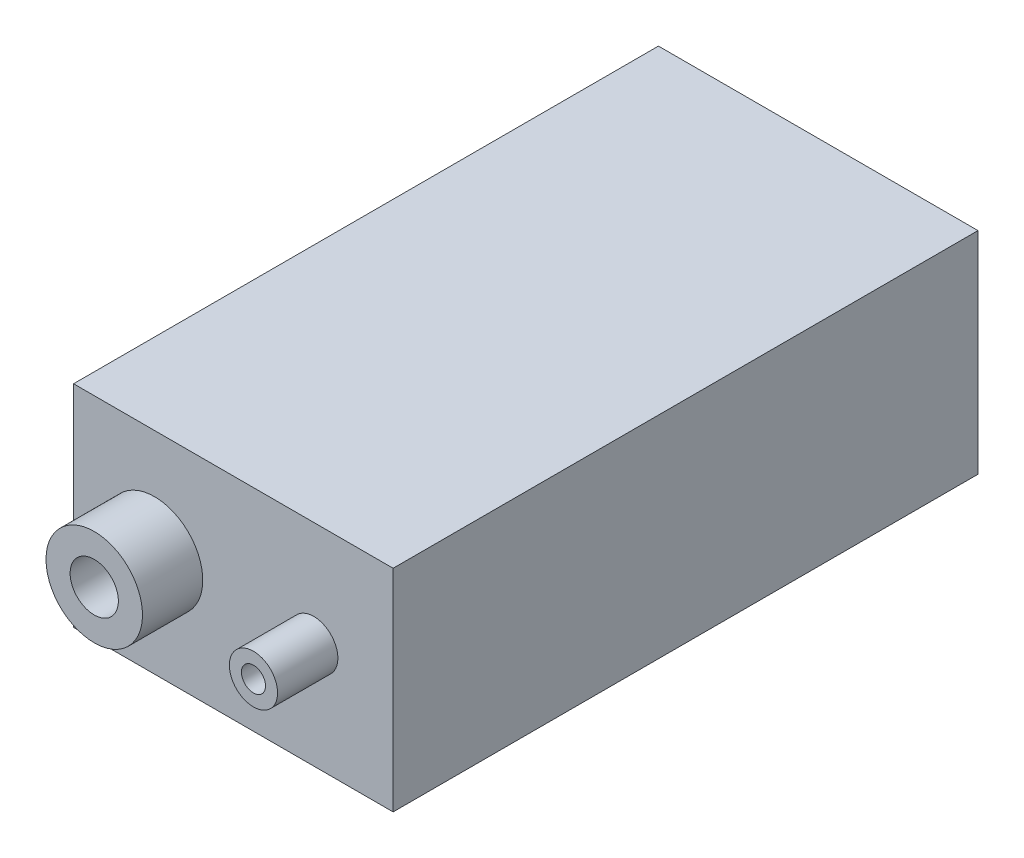
ISO-10303-21;
HEADER;
FILE_DESCRIPTION(('STEP AP214'),'2;1');
FILE_NAME('part.step','',(''),(''),'','','');
FILE_SCHEMA(('AUTOMOTIVE_DESIGN { 1 0 10303 214 1 1 1 1 }'));
ENDSEC;
DATA;
#1=APPLICATION_CONTEXT('core data for automotive mechanical design processes');
#2=APPLICATION_PROTOCOL_DEFINITION('international standard','automotive_design',2000,#1);
#3=PRODUCT_CONTEXT('',#1,'mechanical');
#4=PRODUCT('Part','Part','',(#3));
#5=PRODUCT_RELATED_PRODUCT_CATEGORY('part','',(#4));
#6=PRODUCT_DEFINITION_FORMATION('','',#4);
#7=PRODUCT_DEFINITION_CONTEXT('part definition',#1,'design');
#8=PRODUCT_DEFINITION('design','',#6,#7);
#9=PRODUCT_DEFINITION_SHAPE('','',#8);
#10=(LENGTH_UNIT() NAMED_UNIT(*) SI_UNIT(.MILLI.,.METRE.));
#11=(NAMED_UNIT(*) PLANE_ANGLE_UNIT() SI_UNIT($,.RADIAN.));
#12=(NAMED_UNIT(*) SI_UNIT($,.STERADIAN.) SOLID_ANGLE_UNIT());
#13=UNCERTAINTY_MEASURE_WITH_UNIT(LENGTH_MEASURE(1.E-05),#10,'distance_accuracy_value','');
#14=(GEOMETRIC_REPRESENTATION_CONTEXT(3) GLOBAL_UNCERTAINTY_ASSIGNED_CONTEXT((#13)) GLOBAL_UNIT_ASSIGNED_CONTEXT((#10,
#11,#12)) REPRESENTATION_CONTEXT('',''));
#15=CARTESIAN_POINT('',(0.,0.,0.));
#16=DIRECTION('',(0.,0.,1.));
#17=DIRECTION('',(1.,0.,0.));
#18=AXIS2_PLACEMENT_3D('',#15,#16,#17);
#19=CARTESIAN_POINT('',(0.,0.,48.5));
#20=DIRECTION('',(1.,0.,0.));
#21=DIRECTION('',(0.,0.,-1.));
#22=AXIS2_PLACEMENT_3D('',#19,#20,#21);
#23=PLANE('',#22);
#24=DIRECTION('',(0.,-1.,0.));
#25=VECTOR('',#24,1.);
#26=CARTESIAN_POINT('',(0.,0.,0.));
#27=LINE('',#26,#25);
#28=CARTESIAN_POINT('',(0.,17.5,0.));
#29=VERTEX_POINT('',#28);
#30=CARTESIAN_POINT('',(0.,0.,0.));
#31=VERTEX_POINT('',#30);
#32=EDGE_CURVE('E122',#29,#31,#27,.T.);
#33=ORIENTED_EDGE('',*,*,#32,.T.);
#34=DIRECTION('',(0.,0.,-1.));
#35=VECTOR('',#34,1.);
#36=CARTESIAN_POINT('',(0.,0.,48.5));
#37=LINE('',#36,#35);
#38=CARTESIAN_POINT('',(0.,0.,48.5));
#39=VERTEX_POINT('',#38);
#40=EDGE_CURVE('E110',#39,#31,#37,.T.);
#41=ORIENTED_EDGE('',*,*,#40,.F.);
#42=DIRECTION('',(0.,-1.,0.));
#43=VECTOR('',#42,1.);
#44=CARTESIAN_POINT('',(0.,0.,48.5));
#45=LINE('',#44,#43);
#46=CARTESIAN_POINT('',(0.,17.5,48.5));
#47=VERTEX_POINT('',#46);
#48=EDGE_CURVE('E102',#47,#39,#45,.T.);
#49=ORIENTED_EDGE('',*,*,#48,.F.);
#50=DIRECTION('',(0.,0.,-1.));
#51=VECTOR('',#50,1.);
#52=CARTESIAN_POINT('',(0.,17.5,48.5));
#53=LINE('',#52,#51);
#54=EDGE_CURVE('E118',#47,#29,#53,.T.);
#55=ORIENTED_EDGE('',*,*,#54,.T.);
#56=EDGE_LOOP('',(#33,#41,#49,#55));
#57=FACE_BOUND('',#56,.T.);
#58=ADVANCED_FACE('F49',(#57),#23,.F.);
#59=CARTESIAN_POINT('',(0.,0.,48.5));
#60=DIRECTION('',(0.,1.,0.));
#61=DIRECTION('',(0.,0.,1.));
#62=AXIS2_PLACEMENT_3D('',#59,#60,#61);
#63=PLANE('',#62);
#64=DIRECTION('',(1.,0.,0.));
#65=VECTOR('',#64,1.);
#66=CARTESIAN_POINT('',(0.,0.,0.));
#67=LINE('',#66,#65);
#68=CARTESIAN_POINT('',(26.5,0.,0.));
#69=VERTEX_POINT('',#68);
#70=EDGE_CURVE('E108',#31,#69,#67,.T.);
#71=ORIENTED_EDGE('',*,*,#70,.T.);
#72=DIRECTION('',(0.,0.,-1.));
#73=VECTOR('',#72,1.);
#74=CARTESIAN_POINT('',(26.5,0.,48.5));
#75=LINE('',#74,#73);
#76=CARTESIAN_POINT('',(26.5,0.,48.5));
#77=VERTEX_POINT('',#76);
#78=EDGE_CURVE('E106',#77,#69,#75,.T.);
#79=ORIENTED_EDGE('',*,*,#78,.F.);
#80=DIRECTION('',(1.,0.,0.));
#81=VECTOR('',#80,1.);
#82=CARTESIAN_POINT('',(0.,0.,48.5));
#83=LINE('',#82,#81);
#84=EDGE_CURVE('E97',#39,#77,#83,.T.);
#85=ORIENTED_EDGE('',*,*,#84,.F.);
#86=ORIENTED_EDGE('',*,*,#40,.T.);
#87=EDGE_LOOP('',(#71,#79,#85,#86));
#88=FACE_BOUND('',#87,.T.);
#89=ADVANCED_FACE('F107',(#88),#63,.F.);
#90=CARTESIAN_POINT('',(26.5,0.,48.5));
#91=DIRECTION('',(-1.,0.,0.));
#92=DIRECTION('',(0.,0.,1.));
#93=AXIS2_PLACEMENT_3D('',#90,#91,#92);
#94=PLANE('',#93);
#95=DIRECTION('',(0.,1.,0.));
#96=VECTOR('',#95,1.);
#97=CARTESIAN_POINT('',(26.5,0.,0.));
#98=LINE('',#97,#96);
#99=CARTESIAN_POINT('',(26.5,17.5,0.));
#100=VERTEX_POINT('',#99);
#101=EDGE_CURVE('E83',#69,#100,#98,.T.);
#102=ORIENTED_EDGE('',*,*,#101,.T.);
#103=DIRECTION('',(0.,0.,-1.));
#104=VECTOR('',#103,1.);
#105=CARTESIAN_POINT('',(26.5,17.5,48.5));
#106=LINE('',#105,#104);
#107=CARTESIAN_POINT('',(26.5,17.5,48.5));
#108=VERTEX_POINT('',#107);
#109=EDGE_CURVE('E111',#108,#100,#106,.T.);
#110=ORIENTED_EDGE('',*,*,#109,.F.);
#111=DIRECTION('',(0.,1.,0.));
#112=VECTOR('',#111,1.);
#113=CARTESIAN_POINT('',(26.5,0.,48.5));
#114=LINE('',#113,#112);
#115=EDGE_CURVE('E100',#77,#108,#114,.T.);
#116=ORIENTED_EDGE('',*,*,#115,.F.);
#117=ORIENTED_EDGE('',*,*,#78,.T.);
#118=EDGE_LOOP('',(#102,#110,#116,#117));
#119=FACE_BOUND('',#118,.T.);
#120=ADVANCED_FACE('F113',(#119),#94,.F.);
#121=CARTESIAN_POINT('',(0.,17.5,48.5));
#122=DIRECTION('',(0.,-1.,0.));
#123=DIRECTION('',(0.,0.,-1.));
#124=AXIS2_PLACEMENT_3D('',#121,#122,#123);
#125=PLANE('',#124);
#126=DIRECTION('',(-1.,0.,0.));
#127=VECTOR('',#126,1.);
#128=CARTESIAN_POINT('',(0.,17.5,0.));
#129=LINE('',#128,#127);
#130=EDGE_CURVE('E89',#100,#29,#129,.T.);
#131=ORIENTED_EDGE('',*,*,#130,.T.);
#132=ORIENTED_EDGE('',*,*,#54,.F.);
#133=DIRECTION('',(-1.,0.,0.));
#134=VECTOR('',#133,1.);
#135=CARTESIAN_POINT('',(0.,17.5,48.5));
#136=LINE('',#135,#134);
#137=EDGE_CURVE('E66',#108,#47,#136,.T.);
#138=ORIENTED_EDGE('',*,*,#137,.F.);
#139=ORIENTED_EDGE('',*,*,#109,.T.);
#140=EDGE_LOOP('',(#131,#132,#138,#139));
#141=FACE_BOUND('',#140,.T.);
#142=ADVANCED_FACE('F147',(#141),#125,.F.);
#143=CARTESIAN_POINT('',(0.,0.,48.5));
#144=DIRECTION('',(0.,0.,-1.));
#145=DIRECTION('',(-1.,0.,0.));
#146=AXIS2_PLACEMENT_3D('',#143,#144,#145);
#147=PLANE('',#146);
#148=CARTESIAN_POINT('',(6.71490748224581,8.75,48.5));
#149=DIRECTION('',(0.,0.,-1.));
#150=DIRECTION('',(-1.,0.,0.));
#151=AXIS2_PLACEMENT_3D('',#148,#149,#150);
#152=CIRCLE('',#151,4.);
#153=CARTESIAN_POINT('',(2.71490748224581,8.75,48.5));
#154=VERTEX_POINT('',#153);
#155=EDGE_CURVE('E11',#154,#154,#152,.F.);
#156=ORIENTED_EDGE('',*,*,#155,.F.);
#157=EDGE_LOOP('',(#156));
#158=FACE_BOUND('',#157,.T.);
#159=CARTESIAN_POINT('',(19.9190281180964,8.75,48.5));
#160=DIRECTION('',(0.,0.,-1.));
#161=DIRECTION('',(-1.,0.,0.));
#162=AXIS2_PLACEMENT_3D('',#159,#160,#161);
#163=CIRCLE('',#162,2.);
#164=CARTESIAN_POINT('',(17.9190281180964,8.75,48.5));
#165=VERTEX_POINT('',#164);
#166=EDGE_CURVE('E58',#165,#165,#163,.F.);
#167=ORIENTED_EDGE('',*,*,#166,.F.);
#168=EDGE_LOOP('',(#167));
#169=FACE_BOUND('',#168,.T.);
#170=ORIENTED_EDGE('',*,*,#48,.T.);
#171=ORIENTED_EDGE('',*,*,#84,.T.);
#172=ORIENTED_EDGE('',*,*,#115,.T.);
#173=ORIENTED_EDGE('',*,*,#137,.T.);
#174=EDGE_LOOP('',(#170,#171,#172,#173));
#175=FACE_BOUND('',#174,.T.);
#176=ADVANCED_FACE('F98',(#158,#169,#175),#147,.F.);
#177=CARTESIAN_POINT('',(0.,0.,0.));
#178=DIRECTION('',(0.,0.,-1.));
#179=DIRECTION('',(-1.,0.,0.));
#180=AXIS2_PLACEMENT_3D('',#177,#178,#179);
#181=PLANE('',#180);
#182=ORIENTED_EDGE('',*,*,#32,.F.);
#183=ORIENTED_EDGE('',*,*,#130,.F.);
#184=ORIENTED_EDGE('',*,*,#101,.F.);
#185=ORIENTED_EDGE('',*,*,#70,.F.);
#186=EDGE_LOOP('',(#182,#183,#184,#185));
#187=FACE_BOUND('',#186,.T.);
#188=ADVANCED_FACE('F146',(#187),#181,.T.);
#189=CARTESIAN_POINT('',(19.9190281180964,8.75,53.5));
#190=DIRECTION('',(0.,0.,1.));
#191=DIRECTION('',(1.,0.,0.));
#192=AXIS2_PLACEMENT_3D('',#189,#190,#191);
#193=PLANE('',#192);
#194=CARTESIAN_POINT('',(19.9190281180964,8.75,53.5));
#195=DIRECTION('',(0.,0.,1.));
#196=DIRECTION('',(1.,0.,0.));
#197=AXIS2_PLACEMENT_3D('',#194,#195,#196);
#198=CIRCLE('',#197,2.);
#199=CARTESIAN_POINT('',(21.9190281180964,8.75,53.5));
#200=VERTEX_POINT('',#199);
#201=EDGE_CURVE('E126',#200,#200,#198,.T.);
#202=ORIENTED_EDGE('',*,*,#201,.T.);
#203=EDGE_LOOP('',(#202));
#204=FACE_BOUND('',#203,.T.);
#205=CARTESIAN_POINT('',(19.9190281180964,8.75,53.5));
#206=DIRECTION('',(0.,0.,1.));
#207=DIRECTION('',(1.,0.,0.));
#208=AXIS2_PLACEMENT_3D('',#205,#206,#207);
#209=CIRCLE('',#208,1.);
#210=CARTESIAN_POINT('',(20.9190281180964,8.75,53.5));
#211=VERTEX_POINT('',#210);
#212=EDGE_CURVE('E181',#211,#211,#209,.T.);
#213=ORIENTED_EDGE('',*,*,#212,.F.);
#214=EDGE_LOOP('',(#213));
#215=FACE_BOUND('',#214,.T.);
#216=ADVANCED_FACE('F156',(#204,#215),#193,.T.);
#217=CARTESIAN_POINT('',(19.9190281180964,8.75,53.5));
#218=DIRECTION('',(0.,0.,-1.));
#219=DIRECTION('',(-1.,0.,0.));
#220=AXIS2_PLACEMENT_3D('',#217,#218,#219);
#221=CYLINDRICAL_SURFACE('',#220,2.);
#222=ORIENTED_EDGE('',*,*,#201,.F.);
#223=EDGE_LOOP('',(#222));
#224=FACE_BOUND('',#223,.T.);
#225=ORIENTED_EDGE('',*,*,#166,.T.);
#226=EDGE_LOOP('',(#225));
#227=FACE_BOUND('',#226,.T.);
#228=ADVANCED_FACE('F143',(#224,#227),#221,.T.);
#229=CARTESIAN_POINT('',(19.9190281180964,8.75,53.5));
#230=DIRECTION('',(0.,0.,-1.));
#231=DIRECTION('',(-1.,0.,0.));
#232=AXIS2_PLACEMENT_3D('',#229,#230,#231);
#233=CYLINDRICAL_SURFACE('',#232,1.);
#234=ORIENTED_EDGE('',*,*,#212,.T.);
#235=EDGE_LOOP('',(#234));
#236=FACE_BOUND('',#235,.T.);
#237=CARTESIAN_POINT('',(19.9190281180964,8.75,48.5));
#238=DIRECTION('',(0.,0.,1.));
#239=DIRECTION('',(1.,0.,0.));
#240=AXIS2_PLACEMENT_3D('',#237,#238,#239);
#241=CIRCLE('',#240,1.);
#242=CARTESIAN_POINT('',(20.9190281180964,8.75,48.5));
#243=VERTEX_POINT('',#242);
#244=EDGE_CURVE('E182',#243,#243,#241,.T.);
#245=ORIENTED_EDGE('',*,*,#244,.F.);
#246=EDGE_LOOP('',(#245));
#247=FACE_BOUND('',#246,.T.);
#248=ADVANCED_FACE('F167',(#236,#247),#233,.F.);
#249=ORIENTED_EDGE('',*,*,#244,.T.);
#250=EDGE_LOOP('',(#249));
#251=FACE_BOUND('',#250,.T.);
#252=ADVANCED_FACE('F151',(#251),#147,.F.);
#253=CARTESIAN_POINT('',(6.71490748224581,8.75,53.5));
#254=DIRECTION('',(0.,0.,-1.));
#255=DIRECTION('',(-1.,0.,0.));
#256=AXIS2_PLACEMENT_3D('',#253,#254,#255);
#257=PLANE('',#256);
#258=CARTESIAN_POINT('',(6.71490748224581,8.75,53.5));
#259=DIRECTION('',(0.,0.,1.));
#260=DIRECTION('',(-1.,0.,0.));
#261=AXIS2_PLACEMENT_3D('',#258,#259,#260);
#262=CIRCLE('',#261,4.);
#263=CARTESIAN_POINT('',(2.71490748224581,8.75,53.5));
#264=VERTEX_POINT('',#263);
#265=EDGE_CURVE('E186',#264,#264,#262,.T.);
#266=ORIENTED_EDGE('',*,*,#265,.T.);
#267=EDGE_LOOP('',(#266));
#268=FACE_BOUND('',#267,.T.);
#269=CARTESIAN_POINT('',(6.71490748224581,8.75,53.5));
#270=DIRECTION('',(0.,0.,1.));
#271=DIRECTION('',(-1.,0.,0.));
#272=AXIS2_PLACEMENT_3D('',#269,#270,#271);
#273=CIRCLE('',#272,2.);
#274=CARTESIAN_POINT('',(4.71490748224581,8.75,53.5));
#275=VERTEX_POINT('',#274);
#276=EDGE_CURVE('E193',#275,#275,#273,.T.);
#277=ORIENTED_EDGE('',*,*,#276,.F.);
#278=EDGE_LOOP('',(#277));
#279=FACE_BOUND('',#278,.T.);
#280=ADVANCED_FACE('F166',(#268,#279),#257,.F.);
#281=CARTESIAN_POINT('',(6.71490748224581,8.75,53.5));
#282=DIRECTION('',(0.,0.,-1.));
#283=DIRECTION('',(-1.,0.,0.));
#284=AXIS2_PLACEMENT_3D('',#281,#282,#283);
#285=CYLINDRICAL_SURFACE('',#284,4.);
#286=ORIENTED_EDGE('',*,*,#265,.F.);
#287=EDGE_LOOP('',(#286));
#288=FACE_BOUND('',#287,.T.);
#289=ORIENTED_EDGE('',*,*,#155,.T.);
#290=EDGE_LOOP('',(#289));
#291=FACE_BOUND('',#290,.T.);
#292=ADVANCED_FACE('F206',(#288,#291),#285,.T.);
#293=CARTESIAN_POINT('',(6.71490748224581,8.75,53.5));
#294=DIRECTION('',(0.,0.,-1.));
#295=DIRECTION('',(-1.,0.,0.));
#296=AXIS2_PLACEMENT_3D('',#293,#294,#295);
#297=CYLINDRICAL_SURFACE('',#296,2.);
#298=ORIENTED_EDGE('',*,*,#276,.T.);
#299=EDGE_LOOP('',(#298));
#300=FACE_BOUND('',#299,.T.);
#301=CARTESIAN_POINT('',(6.71490748224581,8.75,48.5));
#302=DIRECTION('',(0.,0.,1.));
#303=DIRECTION('',(-1.,0.,0.));
#304=AXIS2_PLACEMENT_3D('',#301,#302,#303);
#305=CIRCLE('',#304,2.);
#306=CARTESIAN_POINT('',(4.71490748224581,8.75,48.5));
#307=VERTEX_POINT('',#306);
#308=EDGE_CURVE('E194',#307,#307,#305,.T.);
#309=ORIENTED_EDGE('',*,*,#308,.F.);
#310=EDGE_LOOP('',(#309));
#311=FACE_BOUND('',#310,.T.);
#312=ADVANCED_FACE('F163',(#300,#311),#297,.F.);
#313=ORIENTED_EDGE('',*,*,#308,.T.);
#314=EDGE_LOOP('',(#313));
#315=FACE_BOUND('',#314,.T.);
#316=ADVANCED_FACE('F150',(#315),#147,.F.);
#317=CLOSED_SHELL('',(#58,#89,#120,#142,#176,#188,#216,#228,#248,#252,#280,#292,#312,#316));
#318=MANIFOLD_SOLID_BREP('B2',#317);
#319=ADVANCED_BREP_SHAPE_REPRESENTATION('',(#18,#318),#14);
#320=SHAPE_DEFINITION_REPRESENTATION(#9,#319);
ENDSEC;
END-ISO-10303-21;
